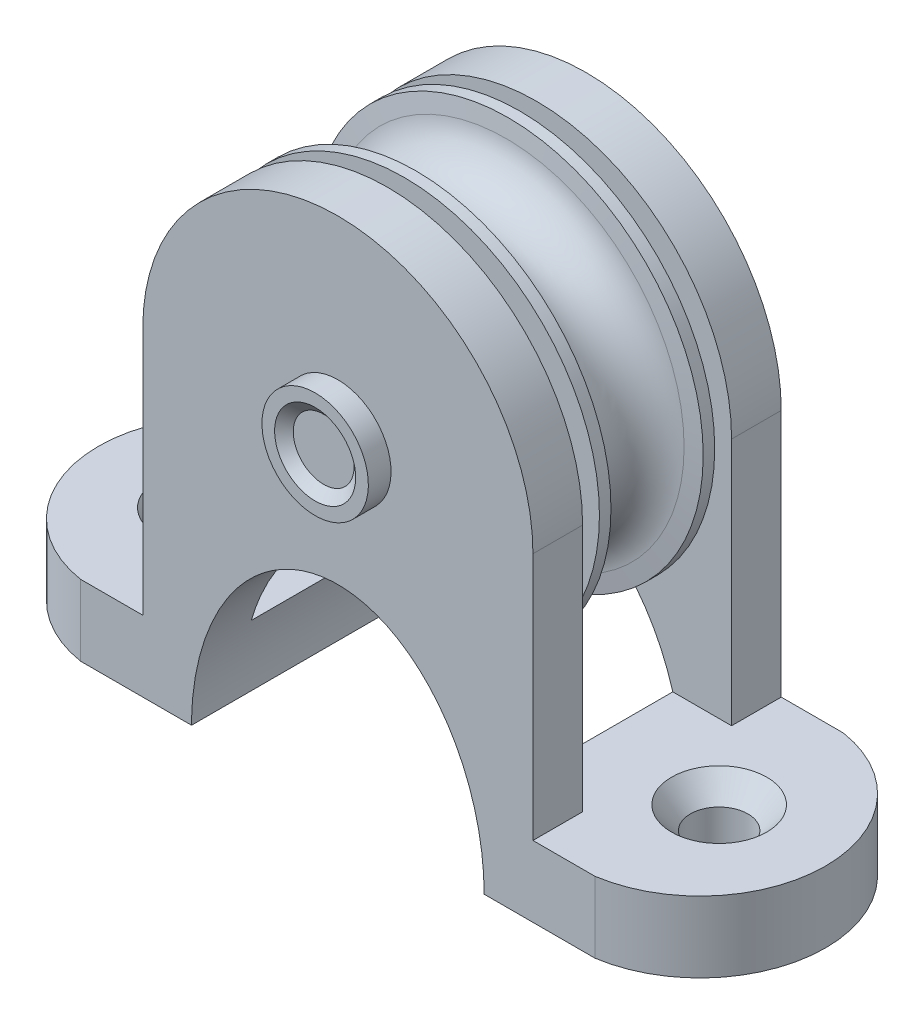
ISO-10303-21;
HEADER;
FILE_DESCRIPTION(('STEP AP214'),'2;1');
FILE_NAME('part.step','',(''),(''),'','','');
FILE_SCHEMA(('AUTOMOTIVE_DESIGN { 1 0 10303 214 1 1 1 1 }'));
ENDSEC;
DATA;
#1=APPLICATION_CONTEXT('core data for automotive mechanical design processes');
#2=APPLICATION_PROTOCOL_DEFINITION('international standard','automotive_design',2000,#1);
#3=PRODUCT_CONTEXT('',#1,'mechanical');
#4=PRODUCT('Part','Part','',(#3));
#5=PRODUCT_RELATED_PRODUCT_CATEGORY('part','',(#4));
#6=PRODUCT_DEFINITION_FORMATION('','',#4);
#7=PRODUCT_DEFINITION_CONTEXT('part definition',#1,'design');
#8=PRODUCT_DEFINITION('design','',#6,#7);
#9=PRODUCT_DEFINITION_SHAPE('','',#8);
#10=(LENGTH_UNIT() NAMED_UNIT(*) SI_UNIT(.MILLI.,.METRE.));
#11=(NAMED_UNIT(*) PLANE_ANGLE_UNIT() SI_UNIT($,.RADIAN.));
#12=(NAMED_UNIT(*) SI_UNIT($,.STERADIAN.) SOLID_ANGLE_UNIT());
#13=UNCERTAINTY_MEASURE_WITH_UNIT(LENGTH_MEASURE(1.E-05),#10,'distance_accuracy_value','');
#14=(GEOMETRIC_REPRESENTATION_CONTEXT(3) GLOBAL_UNCERTAINTY_ASSIGNED_CONTEXT((#13)) GLOBAL_UNIT_ASSIGNED_CONTEXT((#10,
#11,#12)) REPRESENTATION_CONTEXT('',''));
#15=CARTESIAN_POINT('',(0.,0.,0.));
#16=DIRECTION('',(0.,0.,1.));
#17=DIRECTION('',(1.,0.,0.));
#18=AXIS2_PLACEMENT_3D('',#15,#16,#17);
#19=CARTESIAN_POINT('',(32.54375,-22.225,-11.1125));
#20=DIRECTION('',(0.,1.,0.));
#21=DIRECTION('',(0.,0.,1.));
#22=AXIS2_PLACEMENT_3D('',#19,#20,#21);
#23=PLANE('',#22);
#24=DIRECTION('',(0.,0.,1.));
#25=VECTOR('',#24,1.);
#26=CARTESIAN_POINT('',(-12.2002757557206,-22.225,-14.1605));
#27=LINE('',#26,#25);
#28=CARTESIAN_POINT('',(-12.2002757557206,-22.225,-6.6675));
#29=VERTEX_POINT('',#28);
#30=CARTESIAN_POINT('',(-12.2002757557206,-22.225,6.6675));
#31=VERTEX_POINT('',#30);
#32=EDGE_CURVE('E153',#29,#31,#27,.T.);
#33=ORIENTED_EDGE('',*,*,#32,.F.);
#34=DIRECTION('',(1.,0.,0.));
#35=VECTOR('',#34,1.);
#36=CARTESIAN_POINT('',(-17.4625,-22.225,-6.6675));
#37=LINE('',#36,#35);
#38=CARTESIAN_POINT('',(-17.4625,-22.225,-6.6675));
#39=VERTEX_POINT('',#38);
#40=EDGE_CURVE('E162',#39,#29,#37,.T.);
#41=ORIENTED_EDGE('',*,*,#40,.F.);
#42=DIRECTION('',(0.,0.,-1.));
#43=VECTOR('',#42,1.);
#44=CARTESIAN_POINT('',(-17.4625,-22.225,-6.6675));
#45=LINE('',#44,#43);
#46=CARTESIAN_POINT('',(-17.4625,-22.225,-11.1125));
#47=VERTEX_POINT('',#46);
#48=EDGE_CURVE('E194',#39,#47,#45,.T.);
#49=ORIENTED_EDGE('',*,*,#48,.T.);
#50=DIRECTION('',(-1.,0.,0.));
#51=VECTOR('',#50,1.);
#52=CARTESIAN_POINT('',(32.54375,-22.225,-11.1125));
#53=LINE('',#52,#51);
#54=CARTESIAN_POINT('',(-23.01875,-22.225,-11.1125));
#55=VERTEX_POINT('',#54);
#56=EDGE_CURVE('E282',#47,#55,#53,.T.);
#57=ORIENTED_EDGE('',*,*,#56,.T.);
#58=CARTESIAN_POINT('',(-21.2989583333333,-22.225,0.));
#59=DIRECTION('',(0.,1.,0.));
#60=DIRECTION('',(0.,0.,1.));
#61=AXIS2_PLACEMENT_3D('',#58,#59,#60);
#62=CIRCLE('',#61,11.2447916666667);
#63=CARTESIAN_POINT('',(-23.01875,-22.225,11.1125));
#64=VERTEX_POINT('',#63);
#65=EDGE_CURVE('E184',#64,#55,#62,.F.);
#66=ORIENTED_EDGE('',*,*,#65,.F.);
#67=DIRECTION('',(1.,0.,0.));
#68=VECTOR('',#67,1.);
#69=CARTESIAN_POINT('',(-32.54375,-22.225,11.1125));
#70=LINE('',#69,#68);
#71=CARTESIAN_POINT('',(-17.4625,-22.225,11.1125));
#72=VERTEX_POINT('',#71);
#73=EDGE_CURVE('E50',#64,#72,#70,.T.);
#74=ORIENTED_EDGE('',*,*,#73,.T.);
#75=DIRECTION('',(0.,0.,1.));
#76=VECTOR('',#75,1.);
#77=CARTESIAN_POINT('',(-17.4625,-22.225,6.6675));
#78=LINE('',#77,#76);
#79=CARTESIAN_POINT('',(-17.4625,-22.225,6.6675));
#80=VERTEX_POINT('',#79);
#81=EDGE_CURVE('E228',#80,#72,#78,.T.);
#82=ORIENTED_EDGE('',*,*,#81,.F.);
#83=DIRECTION('',(1.,0.,0.));
#84=VECTOR('',#83,1.);
#85=CARTESIAN_POINT('',(-17.4625,-22.225,6.6675));
#86=LINE('',#85,#84);
#87=EDGE_CURVE('E165',#80,#31,#86,.T.);
#88=ORIENTED_EDGE('',*,*,#87,.T.);
#89=EDGE_LOOP('',(#33,#41,#49,#57,#66,#74,#82,#88));
#90=FACE_BOUND('',#89,.T.);
#91=CARTESIAN_POINT('',(-23.01875,-22.225,0.));
#92=DIRECTION('',(0.,1.,0.));
#93=DIRECTION('',(0.,0.,1.));
#94=AXIS2_PLACEMENT_3D('',#91,#92,#93);
#95=CIRCLE('',#94,4.26183731992034);
#96=CARTESIAN_POINT('',(-23.01875,-22.225,4.26183731992034));
#97=VERTEX_POINT('',#96);
#98=EDGE_CURVE('E328',#97,#97,#95,.F.);
#99=ORIENTED_EDGE('',*,*,#98,.T.);
#100=EDGE_LOOP('',(#99));
#101=FACE_BOUND('',#100,.T.);
#102=ADVANCED_FACE('F42',(#90,#101),#23,.T.);
#103=CARTESIAN_POINT('',(32.54375,-28.575,-11.1125));
#104=DIRECTION('',(0.,1.,0.));
#105=DIRECTION('',(0.,0.,1.));
#106=AXIS2_PLACEMENT_3D('',#103,#104,#105);
#107=PLANE('',#106);
#108=CARTESIAN_POINT('',(-23.01875,-28.575,0.));
#109=DIRECTION('',(0.,1.,0.));
#110=DIRECTION('',(0.,0.,1.));
#111=AXIS2_PLACEMENT_3D('',#108,#109,#110);
#112=CIRCLE('',#111,2.5781);
#113=CARTESIAN_POINT('',(-23.01875,-28.575,2.5781));
#114=VERTEX_POINT('',#113);
#115=EDGE_CURVE('E312',#114,#114,#112,.T.);
#116=ORIENTED_EDGE('',*,*,#115,.T.);
#117=EDGE_LOOP('',(#116));
#118=FACE_BOUND('',#117,.T.);
#119=DIRECTION('',(-1.,0.,0.));
#120=VECTOR('',#119,1.);
#121=CARTESIAN_POINT('',(32.54375,-28.575,-11.1125));
#122=LINE('',#121,#120);
#123=CARTESIAN_POINT('',(-13.096875,-28.575,-11.1125));
#124=VERTEX_POINT('',#123);
#125=CARTESIAN_POINT('',(-23.01875,-28.575,-11.1125));
#126=VERTEX_POINT('',#125);
#127=EDGE_CURVE('E308',#124,#126,#122,.T.);
#128=ORIENTED_EDGE('',*,*,#127,.F.);
#129=DIRECTION('',(0.,0.,1.));
#130=VECTOR('',#129,1.);
#131=CARTESIAN_POINT('',(-13.096875,-28.575,-14.1605));
#132=LINE('',#131,#130);
#133=CARTESIAN_POINT('',(-13.096875,-28.575,11.1125));
#134=VERTEX_POINT('',#133);
#135=EDGE_CURVE('E546',#124,#134,#132,.T.);
#136=ORIENTED_EDGE('',*,*,#135,.T.);
#137=DIRECTION('',(1.,0.,0.));
#138=VECTOR('',#137,1.);
#139=CARTESIAN_POINT('',(-32.54375,-28.575,11.1125));
#140=LINE('',#139,#138);
#141=CARTESIAN_POINT('',(-23.01875,-28.575,11.1125));
#142=VERTEX_POINT('',#141);
#143=EDGE_CURVE('E250',#142,#134,#140,.T.);
#144=ORIENTED_EDGE('',*,*,#143,.F.);
#145=CARTESIAN_POINT('',(-21.2989583333333,-28.575,0.));
#146=DIRECTION('',(0.,-1.,0.));
#147=DIRECTION('',(0.,0.,1.));
#148=AXIS2_PLACEMENT_3D('',#145,#146,#147);
#149=CIRCLE('',#148,11.2447916666667);
#150=EDGE_CURVE('E380',#142,#126,#149,.T.);
#151=ORIENTED_EDGE('',*,*,#150,.T.);
#152=EDGE_LOOP('',(#128,#136,#144,#151));
#153=FACE_BOUND('',#152,.T.);
#154=ADVANCED_FACE('F350',(#118,#153),#107,.F.);
#155=DIRECTION('',(0.,0.,1.));
#156=VECTOR('',#155,1.);
#157=CARTESIAN_POINT('',(12.2002757557207,-22.225,-14.1605));
#158=LINE('',#157,#156);
#159=CARTESIAN_POINT('',(12.2002757557207,-22.225,6.6675));
#160=VERTEX_POINT('',#159);
#161=CARTESIAN_POINT('',(12.2002757557207,-22.225,-6.6675));
#162=VERTEX_POINT('',#161);
#163=EDGE_CURVE('E65',#160,#162,#158,.F.);
#164=ORIENTED_EDGE('',*,*,#163,.F.);
#165=CARTESIAN_POINT('',(17.4625,-22.225,6.6675));
#166=VERTEX_POINT('',#165);
#167=EDGE_CURVE('E208',#160,#166,#86,.T.);
#168=ORIENTED_EDGE('',*,*,#167,.T.);
#169=DIRECTION('',(0.,0.,1.));
#170=VECTOR('',#169,1.);
#171=CARTESIAN_POINT('',(17.4625,-22.225,6.6675));
#172=LINE('',#171,#170);
#173=CARTESIAN_POINT('',(17.4625,-22.225,11.1125));
#174=VERTEX_POINT('',#173);
#175=EDGE_CURVE('E220',#166,#174,#172,.T.);
#176=ORIENTED_EDGE('',*,*,#175,.T.);
#177=CARTESIAN_POINT('',(23.01875,-22.225,11.1125));
#178=VERTEX_POINT('',#177);
#179=EDGE_CURVE('E239',#174,#178,#70,.T.);
#180=ORIENTED_EDGE('',*,*,#179,.T.);
#181=CARTESIAN_POINT('',(21.2989583333333,-22.225,0.));
#182=DIRECTION('',(0.,1.,0.));
#183=DIRECTION('',(0.,0.,1.));
#184=AXIS2_PLACEMENT_3D('',#181,#182,#183);
#185=CIRCLE('',#184,11.2447916666667);
#186=CARTESIAN_POINT('',(23.01875,-22.225,-11.1125));
#187=VERTEX_POINT('',#186);
#188=EDGE_CURVE('E374',#187,#178,#185,.F.);
#189=ORIENTED_EDGE('',*,*,#188,.F.);
#190=CARTESIAN_POINT('',(17.4625,-22.225,-11.1125));
#191=VERTEX_POINT('',#190);
#192=EDGE_CURVE('E243',#187,#191,#53,.T.);
#193=ORIENTED_EDGE('',*,*,#192,.T.);
#194=DIRECTION('',(0.,0.,-1.));
#195=VECTOR('',#194,1.);
#196=CARTESIAN_POINT('',(17.4625,-22.225,-6.6675));
#197=LINE('',#196,#195);
#198=CARTESIAN_POINT('',(17.4625,-22.225,-6.6675));
#199=VERTEX_POINT('',#198);
#200=EDGE_CURVE('E196',#199,#191,#197,.T.);
#201=ORIENTED_EDGE('',*,*,#200,.F.);
#202=EDGE_CURVE('E172',#162,#199,#37,.T.);
#203=ORIENTED_EDGE('',*,*,#202,.F.);
#204=EDGE_LOOP('',(#164,#168,#176,#180,#189,#193,#201,#203));
#205=FACE_BOUND('',#204,.T.);
#206=CARTESIAN_POINT('',(23.01875,-22.225,0.));
#207=DIRECTION('',(0.,1.,0.));
#208=DIRECTION('',(0.,0.,1.));
#209=AXIS2_PLACEMENT_3D('',#206,#207,#208);
#210=CIRCLE('',#209,4.26183731992034);
#211=CARTESIAN_POINT('',(23.01875,-22.225,4.26183731992034));
#212=VERTEX_POINT('',#211);
#213=EDGE_CURVE('E320',#212,#212,#210,.F.);
#214=ORIENTED_EDGE('',*,*,#213,.T.);
#215=EDGE_LOOP('',(#214));
#216=FACE_BOUND('',#215,.T.);
#217=ADVANCED_FACE('F263',(#205,#216),#23,.T.);
#218=CARTESIAN_POINT('',(13.096875,-28.575,11.1125));
#219=VERTEX_POINT('',#218);
#220=CARTESIAN_POINT('',(23.01875,-28.575,11.1125));
#221=VERTEX_POINT('',#220);
#222=EDGE_CURVE('E305',#219,#221,#140,.T.);
#223=ORIENTED_EDGE('',*,*,#222,.F.);
#224=DIRECTION('',(0.,0.,1.));
#225=VECTOR('',#224,1.);
#226=CARTESIAN_POINT('',(13.096875,-28.575,-14.1605));
#227=LINE('',#226,#225);
#228=CARTESIAN_POINT('',(13.096875,-28.575,-11.1125));
#229=VERTEX_POINT('',#228);
#230=EDGE_CURVE('E57',#219,#229,#227,.F.);
#231=ORIENTED_EDGE('',*,*,#230,.T.);
#232=CARTESIAN_POINT('',(23.01875,-28.575,-11.1125));
#233=VERTEX_POINT('',#232);
#234=EDGE_CURVE('E245',#233,#229,#122,.T.);
#235=ORIENTED_EDGE('',*,*,#234,.F.);
#236=CARTESIAN_POINT('',(21.2989583333333,-28.575,0.));
#237=DIRECTION('',(0.,-1.,0.));
#238=DIRECTION('',(0.,0.,-1.));
#239=AXIS2_PLACEMENT_3D('',#236,#237,#238);
#240=CIRCLE('',#239,11.2447916666667);
#241=EDGE_CURVE('E367',#233,#221,#240,.T.);
#242=ORIENTED_EDGE('',*,*,#241,.T.);
#243=EDGE_LOOP('',(#223,#231,#235,#242));
#244=FACE_BOUND('',#243,.T.);
#245=CARTESIAN_POINT('',(23.01875,-28.575,0.));
#246=DIRECTION('',(0.,1.,0.));
#247=DIRECTION('',(0.,0.,1.));
#248=AXIS2_PLACEMENT_3D('',#245,#246,#247);
#249=CIRCLE('',#248,2.5781);
#250=CARTESIAN_POINT('',(23.01875,-28.575,2.5781));
#251=VERTEX_POINT('',#250);
#252=EDGE_CURVE('E316',#251,#251,#249,.T.);
#253=ORIENTED_EDGE('',*,*,#252,.T.);
#254=EDGE_LOOP('',(#253));
#255=FACE_BOUND('',#254,.T.);
#256=ADVANCED_FACE('F355',(#244,#255),#107,.F.);
#257=CARTESIAN_POINT('',(32.54375,-22.225,-11.1125));
#258=DIRECTION('',(0.,0.,1.));
#259=DIRECTION('',(1.,0.,0.));
#260=AXIS2_PLACEMENT_3D('',#257,#258,#259);
#261=PLANE('',#260);
#262=ORIENTED_EDGE('',*,*,#234,.T.);
#263=CARTESIAN_POINT('',(0.,-28.575,-11.1125));
#264=DIRECTION('',(0.,0.,1.));
#265=DIRECTION('',(0.,-1.,0.));
#266=AXIS2_PLACEMENT_3D('',#263,#264,#265);
#267=ELLIPSE('',#266,17.4625,13.096875);
#268=EDGE_CURVE('E371',#229,#124,#267,.T.);
#269=ORIENTED_EDGE('',*,*,#268,.T.);
#270=ORIENTED_EDGE('',*,*,#127,.T.);
#271=DIRECTION('',(0.,1.,0.));
#272=VECTOR('',#271,1.);
#273=CARTESIAN_POINT('',(-23.01875,-28.575,-11.1125));
#274=LINE('',#273,#272);
#275=EDGE_CURVE('E287',#126,#55,#274,.T.);
#276=ORIENTED_EDGE('',*,*,#275,.T.);
#277=ORIENTED_EDGE('',*,*,#56,.F.);
#278=DIRECTION('',(0.,-1.,0.));
#279=VECTOR('',#278,1.);
#280=CARTESIAN_POINT('',(-17.4625,0.,-11.1125));
#281=LINE('',#280,#279);
#282=CARTESIAN_POINT('',(-17.4625,0.,-11.1125));
#283=VERTEX_POINT('',#282);
#284=EDGE_CURVE('E186',#283,#47,#281,.T.);
#285=ORIENTED_EDGE('',*,*,#284,.F.);
#286=CARTESIAN_POINT('',(0.,0.,-11.1125));
#287=DIRECTION('',(0.,0.,1.));
#288=DIRECTION('',(1.,0.,0.));
#289=AXIS2_PLACEMENT_3D('',#286,#287,#288);
#290=CIRCLE('',#289,17.4625);
#291=CARTESIAN_POINT('',(17.4625,0.,-11.1125));
#292=VERTEX_POINT('',#291);
#293=EDGE_CURVE('E180',#292,#283,#290,.T.);
#294=ORIENTED_EDGE('',*,*,#293,.F.);
#295=DIRECTION('',(0.,1.,0.));
#296=VECTOR('',#295,1.);
#297=CARTESIAN_POINT('',(17.4625,0.,-11.1125));
#298=LINE('',#297,#296);
#299=EDGE_CURVE('E183',#191,#292,#298,.T.);
#300=ORIENTED_EDGE('',*,*,#299,.F.);
#301=ORIENTED_EDGE('',*,*,#192,.F.);
#302=DIRECTION('',(0.,1.,0.));
#303=VECTOR('',#302,1.);
#304=CARTESIAN_POINT('',(23.01875,-28.575,-11.1125));
#305=LINE('',#304,#303);
#306=EDGE_CURVE('E375',#233,#187,#305,.T.);
#307=ORIENTED_EDGE('',*,*,#306,.F.);
#308=EDGE_LOOP('',(#262,#269,#270,#276,#277,#285,#294,#300,#301,#307));
#309=FACE_BOUND('',#308,.T.);
#310=ADVANCED_FACE('F44',(#309),#261,.F.);
#311=CARTESIAN_POINT('',(-32.54375,-22.225,11.1125));
#312=DIRECTION('',(0.,0.,-1.));
#313=DIRECTION('',(-1.,0.,0.));
#314=AXIS2_PLACEMENT_3D('',#311,#312,#313);
#315=PLANE('',#314);
#316=ORIENTED_EDGE('',*,*,#143,.T.);
#317=CARTESIAN_POINT('',(0.,-28.575,11.1125));
#318=DIRECTION('',(0.,0.,1.));
#319=DIRECTION('',(0.,-1.,0.));
#320=AXIS2_PLACEMENT_3D('',#317,#318,#319);
#321=ELLIPSE('',#320,17.4625,13.096875);
#322=EDGE_CURVE('E543',#134,#219,#321,.F.);
#323=ORIENTED_EDGE('',*,*,#322,.T.);
#324=ORIENTED_EDGE('',*,*,#222,.T.);
#325=DIRECTION('',(0.,1.,0.));
#326=VECTOR('',#325,1.);
#327=CARTESIAN_POINT('',(23.01875,-28.575,11.1125));
#328=LINE('',#327,#326);
#329=EDGE_CURVE('E370',#221,#178,#328,.T.);
#330=ORIENTED_EDGE('',*,*,#329,.T.);
#331=ORIENTED_EDGE('',*,*,#179,.F.);
#332=DIRECTION('',(0.,1.,0.));
#333=VECTOR('',#332,1.);
#334=CARTESIAN_POINT('',(17.4625,0.,11.1125));
#335=LINE('',#334,#333);
#336=CARTESIAN_POINT('',(17.4625,0.,11.1125));
#337=VERTEX_POINT('',#336);
#338=EDGE_CURVE('E205',#174,#337,#335,.T.);
#339=ORIENTED_EDGE('',*,*,#338,.T.);
#340=CARTESIAN_POINT('',(0.,0.,11.1125));
#341=DIRECTION('',(0.,0.,1.));
#342=DIRECTION('',(1.,0.,0.));
#343=AXIS2_PLACEMENT_3D('',#340,#341,#342);
#344=CIRCLE('',#343,17.4625);
#345=CARTESIAN_POINT('',(-17.4625,0.,11.1125));
#346=VERTEX_POINT('',#345);
#347=EDGE_CURVE('E193',#337,#346,#344,.T.);
#348=ORIENTED_EDGE('',*,*,#347,.T.);
#349=DIRECTION('',(0.,-1.,0.));
#350=VECTOR('',#349,1.);
#351=CARTESIAN_POINT('',(-17.4625,0.,11.1125));
#352=LINE('',#351,#350);
#353=EDGE_CURVE('E216',#346,#72,#352,.T.);
#354=ORIENTED_EDGE('',*,*,#353,.T.);
#355=ORIENTED_EDGE('',*,*,#73,.F.);
#356=DIRECTION('',(0.,1.,0.));
#357=VECTOR('',#356,1.);
#358=CARTESIAN_POINT('',(-23.01875,-28.575,11.1125));
#359=LINE('',#358,#357);
#360=EDGE_CURVE('E278',#142,#64,#359,.T.);
#361=ORIENTED_EDGE('',*,*,#360,.F.);
#362=EDGE_LOOP('',(#316,#323,#324,#330,#331,#339,#348,#354,#355,#361));
#363=FACE_BOUND('',#362,.T.);
#364=ADVANCED_FACE('F255',(#363),#315,.F.);
#365=CARTESIAN_POINT('',(-23.01875,-22.225,0.));
#366=DIRECTION('',(0.,-1.,0.));
#367=DIRECTION('',(0.,0.,-1.));
#368=AXIS2_PLACEMENT_3D('',#365,#366,#367);
#369=CYLINDRICAL_SURFACE('',#368,2.5781);
#370=CARTESIAN_POINT('',(-23.01875,-24.2316,0.));
#371=DIRECTION('',(0.,-1.,0.));
#372=DIRECTION('',(0.,0.,-1.));
#373=AXIS2_PLACEMENT_3D('',#370,#371,#372);
#374=CIRCLE('',#373,2.5781);
#375=CARTESIAN_POINT('',(-23.01875,-24.2316,-2.5781));
#376=VERTEX_POINT('',#375);
#377=EDGE_CURVE('E219',#376,#376,#374,.T.);
#378=ORIENTED_EDGE('',*,*,#377,.F.);
#379=EDGE_LOOP('',(#378));
#380=FACE_BOUND('',#379,.T.);
#381=ORIENTED_EDGE('',*,*,#115,.F.);
#382=EDGE_LOOP('',(#381));
#383=FACE_BOUND('',#382,.T.);
#384=ADVANCED_FACE('F336',(#380,#383),#369,.F.);
#385=CARTESIAN_POINT('',(23.01875,-22.225,0.));
#386=DIRECTION('',(0.,-1.,0.));
#387=DIRECTION('',(0.,0.,-1.));
#388=AXIS2_PLACEMENT_3D('',#385,#386,#387);
#389=CYLINDRICAL_SURFACE('',#388,2.5781);
#390=CARTESIAN_POINT('',(23.01875,-24.2316,0.));
#391=DIRECTION('',(0.,-1.,0.));
#392=DIRECTION('',(0.,0.,-1.));
#393=AXIS2_PLACEMENT_3D('',#390,#391,#392);
#394=CIRCLE('',#393,2.5781);
#395=CARTESIAN_POINT('',(23.01875,-24.2316,-2.5781));
#396=VERTEX_POINT('',#395);
#397=EDGE_CURVE('E325',#396,#396,#394,.T.);
#398=ORIENTED_EDGE('',*,*,#397,.F.);
#399=EDGE_LOOP('',(#398));
#400=FACE_BOUND('',#399,.T.);
#401=ORIENTED_EDGE('',*,*,#252,.F.);
#402=EDGE_LOOP('',(#401));
#403=FACE_BOUND('',#402,.T.);
#404=ADVANCED_FACE('F339',(#400,#403),#389,.F.);
#405=CARTESIAN_POINT('',(23.01875,-24.2316,0.));
#406=DIRECTION('',(0.,1.,0.));
#407=DIRECTION('',(0.,0.,-1.));
#408=AXIS2_PLACEMENT_3D('',#405,#406,#407);
#409=CONICAL_SURFACE('',#408,2.5781,0.698131700797733);
#410=ORIENTED_EDGE('',*,*,#397,.T.);
#411=EDGE_LOOP('',(#410));
#412=FACE_BOUND('',#411,.T.);
#413=ORIENTED_EDGE('',*,*,#213,.F.);
#414=EDGE_LOOP('',(#413));
#415=FACE_BOUND('',#414,.T.);
#416=ADVANCED_FACE('F345',(#412,#415),#409,.F.);
#417=CARTESIAN_POINT('',(-23.01875,-24.2316,0.));
#418=DIRECTION('',(0.,1.,0.));
#419=DIRECTION('',(0.,0.,-1.));
#420=AXIS2_PLACEMENT_3D('',#417,#418,#419);
#421=CONICAL_SURFACE('',#420,2.5781,0.698131700797733);
#422=ORIENTED_EDGE('',*,*,#377,.T.);
#423=EDGE_LOOP('',(#422));
#424=FACE_BOUND('',#423,.T.);
#425=ORIENTED_EDGE('',*,*,#98,.F.);
#426=EDGE_LOOP('',(#425));
#427=FACE_BOUND('',#426,.T.);
#428=ADVANCED_FACE('F333',(#424,#427),#421,.F.);
#429=CARTESIAN_POINT('',(0.,0.,6.6675));
#430=DIRECTION('',(0.,0.,1.));
#431=DIRECTION('',(1.,0.,0.));
#432=AXIS2_PLACEMENT_3D('',#429,#430,#431);
#433=CYLINDRICAL_SURFACE('',#432,17.4625);
#434=ORIENTED_EDGE('',*,*,#347,.F.);
#435=DIRECTION('',(0.,0.,1.));
#436=VECTOR('',#435,1.);
#437=CARTESIAN_POINT('',(17.4625,0.,6.6675));
#438=LINE('',#437,#436);
#439=CARTESIAN_POINT('',(17.4625,0.,6.6675));
#440=VERTEX_POINT('',#439);
#441=EDGE_CURVE('E217',#440,#337,#438,.T.);
#442=ORIENTED_EDGE('',*,*,#441,.F.);
#443=CARTESIAN_POINT('',(0.,0.,6.6675));
#444=DIRECTION('',(0.,0.,1.));
#445=DIRECTION('',(1.,0.,0.));
#446=AXIS2_PLACEMENT_3D('',#443,#444,#445);
#447=CIRCLE('',#446,17.4625);
#448=CARTESIAN_POINT('',(-17.4625,0.,6.6675));
#449=VERTEX_POINT('',#448);
#450=EDGE_CURVE('E201',#440,#449,#447,.T.);
#451=ORIENTED_EDGE('',*,*,#450,.T.);
#452=DIRECTION('',(0.,0.,1.));
#453=VECTOR('',#452,1.);
#454=CARTESIAN_POINT('',(-17.4625,0.,6.6675));
#455=LINE('',#454,#453);
#456=EDGE_CURVE('E213',#449,#346,#455,.T.);
#457=ORIENTED_EDGE('',*,*,#456,.T.);
#458=EDGE_LOOP('',(#434,#442,#451,#457));
#459=FACE_BOUND('',#458,.T.);
#460=ADVANCED_FACE('F272',(#459),#433,.T.);
#461=CARTESIAN_POINT('',(17.4625,0.,6.6675));
#462=DIRECTION('',(1.,0.,0.));
#463=DIRECTION('',(0.,1.,0.));
#464=AXIS2_PLACEMENT_3D('',#461,#462,#463);
#465=PLANE('',#464);
#466=ORIENTED_EDGE('',*,*,#338,.F.);
#467=ORIENTED_EDGE('',*,*,#175,.F.);
#468=DIRECTION('',(0.,1.,0.));
#469=VECTOR('',#468,1.);
#470=CARTESIAN_POINT('',(17.4625,0.,6.6675));
#471=LINE('',#470,#469);
#472=EDGE_CURVE('E210',#166,#440,#471,.T.);
#473=ORIENTED_EDGE('',*,*,#472,.T.);
#474=ORIENTED_EDGE('',*,*,#441,.T.);
#475=EDGE_LOOP('',(#466,#467,#473,#474));
#476=FACE_BOUND('',#475,.T.);
#477=ADVANCED_FACE('F260',(#476),#465,.T.);
#478=CARTESIAN_POINT('',(-17.4625,0.,6.6675));
#479=DIRECTION('',(-1.,0.,0.));
#480=DIRECTION('',(0.,-1.,0.));
#481=AXIS2_PLACEMENT_3D('',#478,#479,#480);
#482=PLANE('',#481);
#483=ORIENTED_EDGE('',*,*,#353,.F.);
#484=ORIENTED_EDGE('',*,*,#456,.F.);
#485=DIRECTION('',(0.,-1.,0.));
#486=VECTOR('',#485,1.);
#487=CARTESIAN_POINT('',(-17.4625,0.,6.6675));
#488=LINE('',#487,#486);
#489=EDGE_CURVE('E204',#449,#80,#488,.T.);
#490=ORIENTED_EDGE('',*,*,#489,.T.);
#491=ORIENTED_EDGE('',*,*,#81,.T.);
#492=EDGE_LOOP('',(#483,#484,#490,#491));
#493=FACE_BOUND('',#492,.T.);
#494=ADVANCED_FACE('F275',(#493),#482,.T.);
#495=CARTESIAN_POINT('',(0.,0.,6.6675));
#496=DIRECTION('',(0.,0.,1.));
#497=DIRECTION('',(1.,0.,0.));
#498=AXIS2_PLACEMENT_3D('',#495,#496,#497);
#499=PLANE('',#498);
#500=ORIENTED_EDGE('',*,*,#167,.F.);
#501=CARTESIAN_POINT('',(0.,-28.575,6.6675));
#502=DIRECTION('',(0.,0.,1.));
#503=DIRECTION('',(0.,-1.,0.));
#504=AXIS2_PLACEMENT_3D('',#501,#502,#503);
#505=ELLIPSE('',#504,17.4625,13.096875);
#506=EDGE_CURVE('E166',#160,#31,#505,.T.);
#507=ORIENTED_EDGE('',*,*,#506,.T.);
#508=ORIENTED_EDGE('',*,*,#87,.F.);
#509=ORIENTED_EDGE('',*,*,#489,.F.);
#510=ORIENTED_EDGE('',*,*,#450,.F.);
#511=ORIENTED_EDGE('',*,*,#472,.F.);
#512=EDGE_LOOP('',(#500,#507,#508,#509,#510,#511));
#513=FACE_BOUND('',#512,.T.);
#514=ADVANCED_FACE('F268',(#513),#499,.F.);
#515=CARTESIAN_POINT('',(0.,0.,-6.6675));
#516=DIRECTION('',(0.,0.,-1.));
#517=DIRECTION('',(-1.,0.,0.));
#518=AXIS2_PLACEMENT_3D('',#515,#516,#517);
#519=CYLINDRICAL_SURFACE('',#518,17.4625);
#520=ORIENTED_EDGE('',*,*,#293,.T.);
#521=DIRECTION('',(0.,0.,-1.));
#522=VECTOR('',#521,1.);
#523=CARTESIAN_POINT('',(-17.4625,0.,-6.6675));
#524=LINE('',#523,#522);
#525=CARTESIAN_POINT('',(-17.4625,0.,-6.6675));
#526=VERTEX_POINT('',#525);
#527=EDGE_CURVE('E190',#526,#283,#524,.T.);
#528=ORIENTED_EDGE('',*,*,#527,.F.);
#529=CARTESIAN_POINT('',(0.,0.,-6.6675));
#530=DIRECTION('',(0.,0.,1.));
#531=DIRECTION('',(1.,0.,0.));
#532=AXIS2_PLACEMENT_3D('',#529,#530,#531);
#533=CIRCLE('',#532,17.4625);
#534=CARTESIAN_POINT('',(17.4625,0.,-6.6675));
#535=VERTEX_POINT('',#534);
#536=EDGE_CURVE('E189',#535,#526,#533,.T.);
#537=ORIENTED_EDGE('',*,*,#536,.F.);
#538=DIRECTION('',(0.,0.,-1.));
#539=VECTOR('',#538,1.);
#540=CARTESIAN_POINT('',(17.4625,0.,-6.6675));
#541=LINE('',#540,#539);
#542=EDGE_CURVE('E174',#535,#292,#541,.T.);
#543=ORIENTED_EDGE('',*,*,#542,.T.);
#544=EDGE_LOOP('',(#520,#528,#537,#543));
#545=FACE_BOUND('',#544,.T.);
#546=ADVANCED_FACE('F300',(#545),#519,.T.);
#547=CARTESIAN_POINT('',(-17.4625,0.,-6.6675));
#548=DIRECTION('',(1.,0.,0.));
#549=DIRECTION('',(0.,1.,0.));
#550=AXIS2_PLACEMENT_3D('',#547,#548,#549);
#551=PLANE('',#550);
#552=ORIENTED_EDGE('',*,*,#284,.T.);
#553=ORIENTED_EDGE('',*,*,#48,.F.);
#554=DIRECTION('',(0.,-1.,0.));
#555=VECTOR('',#554,1.);
#556=CARTESIAN_POINT('',(-17.4625,0.,-6.6675));
#557=LINE('',#556,#555);
#558=EDGE_CURVE('E170',#526,#39,#557,.T.);
#559=ORIENTED_EDGE('',*,*,#558,.F.);
#560=ORIENTED_EDGE('',*,*,#527,.T.);
#561=EDGE_LOOP('',(#552,#553,#559,#560));
#562=FACE_BOUND('',#561,.T.);
#563=ADVANCED_FACE('F302',(#562),#551,.F.);
#564=CARTESIAN_POINT('',(17.4625,0.,-6.6675));
#565=DIRECTION('',(-1.,0.,0.));
#566=DIRECTION('',(0.,-1.,0.));
#567=AXIS2_PLACEMENT_3D('',#564,#565,#566);
#568=PLANE('',#567);
#569=ORIENTED_EDGE('',*,*,#299,.T.);
#570=ORIENTED_EDGE('',*,*,#542,.F.);
#571=DIRECTION('',(0.,1.,0.));
#572=VECTOR('',#571,1.);
#573=CARTESIAN_POINT('',(17.4625,0.,-6.6675));
#574=LINE('',#573,#572);
#575=EDGE_CURVE('E176',#199,#535,#574,.T.);
#576=ORIENTED_EDGE('',*,*,#575,.F.);
#577=ORIENTED_EDGE('',*,*,#200,.T.);
#578=EDGE_LOOP('',(#569,#570,#576,#577));
#579=FACE_BOUND('',#578,.T.);
#580=ADVANCED_FACE('F296',(#579),#568,.F.);
#581=CARTESIAN_POINT('',(0.,0.,-6.6675));
#582=DIRECTION('',(0.,0.,-1.));
#583=DIRECTION('',(1.,0.,0.));
#584=AXIS2_PLACEMENT_3D('',#581,#582,#583);
#585=PLANE('',#584);
#586=ORIENTED_EDGE('',*,*,#40,.T.);
#587=CARTESIAN_POINT('',(0.,-28.575,-6.6675));
#588=DIRECTION('',(0.,0.,1.));
#589=DIRECTION('',(0.,-1.,0.));
#590=AXIS2_PLACEMENT_3D('',#587,#588,#589);
#591=ELLIPSE('',#590,17.4625,13.096875);
#592=EDGE_CURVE('E12',#29,#162,#591,.F.);
#593=ORIENTED_EDGE('',*,*,#592,.T.);
#594=ORIENTED_EDGE('',*,*,#202,.T.);
#595=ORIENTED_EDGE('',*,*,#575,.T.);
#596=ORIENTED_EDGE('',*,*,#536,.T.);
#597=ORIENTED_EDGE('',*,*,#558,.T.);
#598=EDGE_LOOP('',(#586,#593,#594,#595,#596,#597));
#599=FACE_BOUND('',#598,.T.);
#600=ADVANCED_FACE('F168',(#599),#585,.F.);
#601=CARTESIAN_POINT('',(-21.2989583333333,-28.575,0.));
#602=DIRECTION('',(0.,1.,0.));
#603=DIRECTION('',(0.,0.,1.));
#604=AXIS2_PLACEMENT_3D('',#601,#602,#603);
#605=CYLINDRICAL_SURFACE('',#604,11.2447916666667);
#606=ORIENTED_EDGE('',*,*,#65,.T.);
#607=ORIENTED_EDGE('',*,*,#275,.F.);
#608=ORIENTED_EDGE('',*,*,#150,.F.);
#609=ORIENTED_EDGE('',*,*,#360,.T.);
#610=EDGE_LOOP('',(#606,#607,#608,#609));
#611=FACE_BOUND('',#610,.T.);
#612=ADVANCED_FACE('F383',(#611),#605,.T.);
#613=CARTESIAN_POINT('',(21.2989583333333,-28.575,0.));
#614=DIRECTION('',(0.,1.,0.));
#615=DIRECTION('',(0.,0.,1.));
#616=AXIS2_PLACEMENT_3D('',#613,#614,#615);
#617=CYLINDRICAL_SURFACE('',#616,11.2447916666667);
#618=ORIENTED_EDGE('',*,*,#188,.T.);
#619=ORIENTED_EDGE('',*,*,#329,.F.);
#620=ORIENTED_EDGE('',*,*,#241,.F.);
#621=ORIENTED_EDGE('',*,*,#306,.T.);
#622=EDGE_LOOP('',(#618,#619,#620,#621));
#623=FACE_BOUND('',#622,.T.);
#624=ADVANCED_FACE('F373',(#623),#617,.T.);
#625=CARTESIAN_POINT('',(0.,-28.575,-14.1605));
#626=DIRECTION('',(0.,0.,1.));
#627=DIRECTION('',(0.,-1.,0.));
#628=AXIS2_PLACEMENT_3D('',#625,#626,#627);
#629=ELLIPSE('',#628,17.4625,13.096875);
#630=DIRECTION('',(0.,0.,1.));
#631=VECTOR('',#630,1.);
#632=SURFACE_OF_LINEAR_EXTRUSION('',#629,#631);
#633=ORIENTED_EDGE('',*,*,#163,.T.);
#634=ORIENTED_EDGE('',*,*,#592,.F.);
#635=ORIENTED_EDGE('',*,*,#32,.T.);
#636=ORIENTED_EDGE('',*,*,#506,.F.);
#637=EDGE_LOOP('',(#633,#634,#635,#636));
#638=FACE_BOUND('',#637,.T.);
#639=ORIENTED_EDGE('',*,*,#230,.F.);
#640=ORIENTED_EDGE('',*,*,#322,.F.);
#641=ORIENTED_EDGE('',*,*,#135,.F.);
#642=ORIENTED_EDGE('',*,*,#268,.F.);
#643=EDGE_LOOP('',(#639,#640,#641,#642));
#644=FACE_BOUND('',#643,.T.);
#645=ADVANCED_FACE('F152',(#638,#644),#632,.F.);
#646=CLOSED_SHELL('',(#102,#154,#217,#256,#310,#364,#384,#404,#416,#428,#460,#477,#494,#514,
#546,#563,#580,#600,#612,#624,#645));
#647=MANIFOLD_SOLID_BREP('B2',#646);
#648=CARTESIAN_POINT('',(0.,0.,5.159375));
#649=DIRECTION('',(0.,0.,1.));
#650=DIRECTION('',(1.,0.,0.));
#651=AXIS2_PLACEMENT_3D('',#648,#649,#650);
#652=CYLINDRICAL_SURFACE('',#651,17.4625);
#653=CARTESIAN_POINT('',(0.,0.,5.159375));
#654=DIRECTION('',(0.,0.,1.));
#655=DIRECTION('',(1.,0.,0.));
#656=AXIS2_PLACEMENT_3D('',#653,#654,#655);
#657=CIRCLE('',#656,17.4625);
#658=CARTESIAN_POINT('',(17.4625,0.,5.159375));
#659=VERTEX_POINT('',#658);
#660=EDGE_CURVE('E574',#659,#659,#657,.T.);
#661=ORIENTED_EDGE('',*,*,#660,.F.);
#662=EDGE_LOOP('',(#661));
#663=FACE_BOUND('',#662,.T.);
#664=CARTESIAN_POINT('',(0.,0.,4.1275));
#665=DIRECTION('',(0.,0.,1.));
#666=DIRECTION('',(1.,0.,0.));
#667=AXIS2_PLACEMENT_3D('',#664,#665,#666);
#668=CIRCLE('',#667,17.4625);
#669=CARTESIAN_POINT('',(17.4625,0.,4.1275));
#670=VERTEX_POINT('',#669);
#671=EDGE_CURVE('E41',#670,#670,#668,.T.);
#672=ORIENTED_EDGE('',*,*,#671,.T.);
#673=EDGE_LOOP('',(#672));
#674=FACE_BOUND('',#673,.T.);
#675=ADVANCED_FACE('F552',(#663,#674),#652,.T.);
#676=CARTESIAN_POINT('',(0.,0.,3.93845834351105));
#677=DIRECTION('',(0.,0.,1.));
#678=DIRECTION('',(1.,0.,0.));
#679=AXIS2_PLACEMENT_3D('',#676,#677,#678);
#680=CONICAL_SURFACE('',#679,15.9412147028789,1.44716564723654);
#681=ORIENTED_EDGE('',*,*,#671,.F.);
#682=EDGE_LOOP('',(#681));
#683=FACE_BOUND('',#682,.T.);
#684=CARTESIAN_POINT('',(0.,0.,3.93845834351105));
#685=DIRECTION('',(0.,0.,1.));
#686=DIRECTION('',(1.,0.,0.));
#687=AXIS2_PLACEMENT_3D('',#684,#685,#686);
#688=CIRCLE('',#687,15.9412147028789);
#689=CARTESIAN_POINT('',(15.9412147028789,0.,3.93845834351105));
#690=VERTEX_POINT('',#689);
#691=EDGE_CURVE('E559',#690,#690,#688,.T.);
#692=ORIENTED_EDGE('',*,*,#691,.T.);
#693=EDGE_LOOP('',(#692));
#694=FACE_BOUND('',#693,.T.);
#695=ADVANCED_FACE('F625',(#683,#694),#680,.T.);
#696=CARTESIAN_POINT('',(0.,0.,0.));
#697=DIRECTION('',(0.,0.,1.));
#698=DIRECTION('',(1.,0.,0.));
#699=AXIS2_PLACEMENT_3D('',#696,#697,#698);
#700=TOROIDAL_SURFACE('',#699,16.430625,3.96875);
#701=ORIENTED_EDGE('',*,*,#691,.F.);
#702=EDGE_LOOP('',(#701));
#703=FACE_BOUND('',#702,.T.);
#704=CARTESIAN_POINT('',(0.,0.,-3.93845834351105));
#705=DIRECTION('',(0.,0.,1.));
#706=DIRECTION('',(1.,0.,0.));
#707=AXIS2_PLACEMENT_3D('',#704,#705,#706);
#708=CIRCLE('',#707,15.9412147028789);
#709=CARTESIAN_POINT('',(15.9412147028789,0.,-3.93845834351105));
#710=VERTEX_POINT('',#709);
#711=EDGE_CURVE('E563',#710,#710,#708,.T.);
#712=ORIENTED_EDGE('',*,*,#711,.T.);
#713=EDGE_LOOP('',(#712));
#714=FACE_BOUND('',#713,.T.);
#715=ADVANCED_FACE('F630',(#703,#714),#700,.F.);
#716=CARTESIAN_POINT('',(0.,0.,-4.1275));
#717=DIRECTION('',(0.,0.,-1.));
#718=DIRECTION('',(-1.,0.,0.));
#719=AXIS2_PLACEMENT_3D('',#716,#717,#718);
#720=CONICAL_SURFACE('',#719,17.4625,1.44716564723654);
#721=ORIENTED_EDGE('',*,*,#711,.F.);
#722=EDGE_LOOP('',(#721));
#723=FACE_BOUND('',#722,.T.);
#724=CARTESIAN_POINT('',(0.,0.,-4.1275));
#725=DIRECTION('',(0.,0.,1.));
#726=DIRECTION('',(1.,0.,0.));
#727=AXIS2_PLACEMENT_3D('',#724,#725,#726);
#728=CIRCLE('',#727,17.4625);
#729=CARTESIAN_POINT('',(17.4625,0.,-4.1275));
#730=VERTEX_POINT('',#729);
#731=EDGE_CURVE('E568',#730,#730,#728,.T.);
#732=ORIENTED_EDGE('',*,*,#731,.T.);
#733=EDGE_LOOP('',(#732));
#734=FACE_BOUND('',#733,.T.);
#735=ADVANCED_FACE('F637',(#723,#734),#720,.T.);
#736=CARTESIAN_POINT('',(0.,0.,5.159375));
#737=DIRECTION('',(0.,0.,1.));
#738=DIRECTION('',(1.,0.,0.));
#739=AXIS2_PLACEMENT_3D('',#736,#737,#738);
#740=CYLINDRICAL_SURFACE('',#739,17.4625);
#741=ORIENTED_EDGE('',*,*,#731,.F.);
#742=EDGE_LOOP('',(#741));
#743=FACE_BOUND('',#742,.T.);
#744=CARTESIAN_POINT('',(0.,0.,-5.159375));
#745=DIRECTION('',(0.,0.,1.));
#746=DIRECTION('',(1.,0.,0.));
#747=AXIS2_PLACEMENT_3D('',#744,#745,#746);
#748=CIRCLE('',#747,17.4625);
#749=CARTESIAN_POINT('',(17.4625,0.,-5.159375));
#750=VERTEX_POINT('',#749);
#751=EDGE_CURVE('E571',#750,#750,#748,.T.);
#752=ORIENTED_EDGE('',*,*,#751,.T.);
#753=EDGE_LOOP('',(#752));
#754=FACE_BOUND('',#753,.T.);
#755=ADVANCED_FACE('F644',(#743,#754),#740,.T.);
#756=CARTESIAN_POINT('',(0.,0.,-5.159375));
#757=DIRECTION('',(0.,0.,1.));
#758=DIRECTION('',(1.,0.,0.));
#759=AXIS2_PLACEMENT_3D('',#756,#757,#758);
#760=PLANE('',#759);
#761=CARTESIAN_POINT('',(0.,0.,-5.159375));
#762=DIRECTION('',(0.,0.,1.));
#763=DIRECTION('',(1.,0.,0.));
#764=AXIS2_PLACEMENT_3D('',#761,#762,#763);
#765=CIRCLE('',#764,3.175);
#766=CARTESIAN_POINT('',(3.175,0.,-5.159375));
#767=VERTEX_POINT('',#766);
#768=EDGE_CURVE('E577',#767,#767,#765,.T.);
#769=ORIENTED_EDGE('',*,*,#768,.T.);
#770=EDGE_LOOP('',(#769));
#771=FACE_BOUND('',#770,.T.);
#772=ORIENTED_EDGE('',*,*,#751,.F.);
#773=EDGE_LOOP('',(#772));
#774=FACE_BOUND('',#773,.T.);
#775=ADVANCED_FACE('F621',(#771,#774),#760,.F.);
#776=CARTESIAN_POINT('',(0.,17.4625,5.159375));
#777=DIRECTION('',(0.,0.,-1.));
#778=DIRECTION('',(-1.,0.,0.));
#779=AXIS2_PLACEMENT_3D('',#776,#777,#778);
#780=PLANE('',#779);
#781=CARTESIAN_POINT('',(0.,0.,5.159375));
#782=DIRECTION('',(0.,0.,-1.));
#783=DIRECTION('',(-1.,0.,0.));
#784=AXIS2_PLACEMENT_3D('',#781,#782,#783);
#785=CIRCLE('',#784,3.175);
#786=CARTESIAN_POINT('',(-3.175,0.,5.159375));
#787=VERTEX_POINT('',#786);
#788=EDGE_CURVE('E555',#787,#787,#785,.T.);
#789=ORIENTED_EDGE('',*,*,#788,.T.);
#790=EDGE_LOOP('',(#789));
#791=FACE_BOUND('',#790,.T.);
#792=ORIENTED_EDGE('',*,*,#660,.T.);
#793=EDGE_LOOP('',(#792));
#794=FACE_BOUND('',#793,.T.);
#795=ADVANCED_FACE('F611',(#791,#794),#780,.F.);
#796=CARTESIAN_POINT('',(0.,0.,-14.1605));
#797=DIRECTION('',(0.,0.,-1.));
#798=DIRECTION('',(0.,1.,0.));
#799=AXIS2_PLACEMENT_3D('',#796,#797,#798);
#800=CYLINDRICAL_SURFACE('',#799,4.7625);
#801=CARTESIAN_POINT('',(0.,0.,13.1445));
#802=DIRECTION('',(0.,0.,-1.));
#803=DIRECTION('',(0.,1.,0.));
#804=AXIS2_PLACEMENT_3D('',#801,#802,#803);
#805=CIRCLE('',#804,4.7625);
#806=CARTESIAN_POINT('',(0.,4.7625,13.1445));
#807=VERTEX_POINT('',#806);
#808=EDGE_CURVE('E598',#807,#807,#805,.T.);
#809=ORIENTED_EDGE('',*,*,#808,.T.);
#810=EDGE_LOOP('',(#809));
#811=FACE_BOUND('',#810,.T.);
#812=CARTESIAN_POINT('',(0.,0.,11.1125));
#813=DIRECTION('',(0.,0.,-1.));
#814=DIRECTION('',(0.,1.,0.));
#815=AXIS2_PLACEMENT_3D('',#812,#813,#814);
#816=CIRCLE('',#815,4.7625);
#817=CARTESIAN_POINT('',(0.,4.7625,11.1125));
#818=VERTEX_POINT('',#817);
#819=EDGE_CURVE('E601',#818,#818,#816,.T.);
#820=ORIENTED_EDGE('',*,*,#819,.F.);
#821=EDGE_LOOP('',(#820));
#822=FACE_BOUND('',#821,.T.);
#823=ADVANCED_FACE('F608',(#811,#822),#800,.T.);
#824=CARTESIAN_POINT('',(0.,4.7625,13.1445));
#825=DIRECTION('',(0.,0.,1.));
#826=DIRECTION('',(0.,-1.,0.));
#827=AXIS2_PLACEMENT_3D('',#824,#825,#826);
#828=PLANE('',#827);
#829=CARTESIAN_POINT('',(0.,0.,13.1445));
#830=DIRECTION('',(0.,0.,-1.));
#831=DIRECTION('',(0.,1.,0.));
#832=AXIS2_PLACEMENT_3D('',#829,#830,#831);
#833=CIRCLE('',#832,3.62905811877839);
#834=CARTESIAN_POINT('',(0.,3.62905811877839,13.1445));
#835=VERTEX_POINT('',#834);
#836=EDGE_CURVE('E595',#835,#835,#833,.T.);
#837=ORIENTED_EDGE('',*,*,#836,.T.);
#838=EDGE_LOOP('',(#837));
#839=FACE_BOUND('',#838,.T.);
#840=ORIENTED_EDGE('',*,*,#808,.F.);
#841=EDGE_LOOP('',(#840));
#842=FACE_BOUND('',#841,.T.);
#843=ADVANCED_FACE('F610',(#839,#842),#828,.T.);
#844=CARTESIAN_POINT('',(0.,0.,13.1445));
#845=DIRECTION('',(0.,0.,1.));
#846=DIRECTION('',(0.,-1.,0.));
#847=AXIS2_PLACEMENT_3D('',#844,#845,#846);
#848=CONICAL_SURFACE('',#847,3.62905811877839,0.872664625997158);
#849=CARTESIAN_POINT('',(0.,0.,12.3825));
#850=DIRECTION('',(0.,0.,-1.));
#851=DIRECTION('',(0.,1.,0.));
#852=AXIS2_PLACEMENT_3D('',#849,#850,#851);
#853=CIRCLE('',#852,2.72094188122161);
#854=CARTESIAN_POINT('',(0.,2.72094188122161,12.3825));
#855=VERTEX_POINT('',#854);
#856=EDGE_CURVE('E592',#855,#855,#853,.T.);
#857=ORIENTED_EDGE('',*,*,#856,.T.);
#858=EDGE_LOOP('',(#857));
#859=FACE_BOUND('',#858,.T.);
#860=ORIENTED_EDGE('',*,*,#836,.F.);
#861=EDGE_LOOP('',(#860));
#862=FACE_BOUND('',#861,.T.);
#863=ADVANCED_FACE('F618',(#859,#862),#848,.F.);
#864=CARTESIAN_POINT('',(0.,2.72094188122161,12.3825));
#865=DIRECTION('',(0.,0.,1.));
#866=DIRECTION('',(0.,-1.,0.));
#867=AXIS2_PLACEMENT_3D('',#864,#865,#866);
#868=PLANE('',#867);
#869=ORIENTED_EDGE('',*,*,#856,.F.);
#870=EDGE_LOOP('',(#869));
#871=FACE_BOUND('',#870,.T.);
#872=ADVANCED_FACE('F655',(#871),#868,.T.);
#873=CARTESIAN_POINT('',(0.,3.175,11.1125));
#874=DIRECTION('',(0.,0.,-1.));
#875=DIRECTION('',(0.,1.,0.));
#876=AXIS2_PLACEMENT_3D('',#873,#874,#875);
#877=PLANE('',#876);
#878=ORIENTED_EDGE('',*,*,#819,.T.);
#879=EDGE_LOOP('',(#878));
#880=FACE_BOUND('',#879,.T.);
#881=CARTESIAN_POINT('',(0.,0.,11.1125));
#882=DIRECTION('',(0.,0.,-1.));
#883=DIRECTION('',(0.,1.,0.));
#884=AXIS2_PLACEMENT_3D('',#881,#882,#883);
#885=CIRCLE('',#884,3.175);
#886=CARTESIAN_POINT('',(0.,3.175,11.1125));
#887=VERTEX_POINT('',#886);
#888=EDGE_CURVE('E580',#887,#887,#885,.T.);
#889=ORIENTED_EDGE('',*,*,#888,.F.);
#890=EDGE_LOOP('',(#889));
#891=FACE_BOUND('',#890,.T.);
#892=ADVANCED_FACE('F605',(#880,#891),#877,.T.);
#893=CARTESIAN_POINT('',(0.,0.,-14.1605));
#894=DIRECTION('',(0.,0.,-1.));
#895=DIRECTION('',(0.,1.,0.));
#896=AXIS2_PLACEMENT_3D('',#893,#894,#895);
#897=CYLINDRICAL_SURFACE('',#896,3.175);
#898=ORIENTED_EDGE('',*,*,#888,.T.);
#899=EDGE_LOOP('',(#898));
#900=FACE_BOUND('',#899,.T.);
#901=ORIENTED_EDGE('',*,*,#788,.F.);
#902=EDGE_LOOP('',(#901));
#903=FACE_BOUND('',#902,.T.);
#904=ADVANCED_FACE('F654',(#900,#903),#897,.T.);
#905=CARTESIAN_POINT('',(0.,0.,-11.1125));
#906=DIRECTION('',(0.,0.,-1.));
#907=DIRECTION('',(0.,1.,0.));
#908=AXIS2_PLACEMENT_3D('',#905,#906,#907);
#909=CIRCLE('',#908,3.175);
#910=CARTESIAN_POINT('',(0.,3.175,-11.1125));
#911=VERTEX_POINT('',#910);
#912=EDGE_CURVE('E583',#911,#911,#909,.T.);
#913=ORIENTED_EDGE('',*,*,#912,.F.);
#914=EDGE_LOOP('',(#913));
#915=FACE_BOUND('',#914,.T.);
#916=ORIENTED_EDGE('',*,*,#768,.F.);
#917=EDGE_LOOP('',(#916));
#918=FACE_BOUND('',#917,.T.);
#919=ADVANCED_FACE('F656',(#915,#918),#897,.T.);
#920=CARTESIAN_POINT('',(0.,3.175,-11.1125));
#921=DIRECTION('',(0.,0.,1.));
#922=DIRECTION('',(0.,-1.,0.));
#923=AXIS2_PLACEMENT_3D('',#920,#921,#922);
#924=PLANE('',#923);
#925=ORIENTED_EDGE('',*,*,#912,.T.);
#926=EDGE_LOOP('',(#925));
#927=FACE_BOUND('',#926,.T.);
#928=CARTESIAN_POINT('',(0.,0.,-11.1125));
#929=DIRECTION('',(0.,0.,-1.));
#930=DIRECTION('',(0.,1.,0.));
#931=AXIS2_PLACEMENT_3D('',#928,#929,#930);
#932=CIRCLE('',#931,5.55625);
#933=CARTESIAN_POINT('',(0.,5.55625,-11.1125));
#934=VERTEX_POINT('',#933);
#935=EDGE_CURVE('E586',#934,#934,#932,.T.);
#936=ORIENTED_EDGE('',*,*,#935,.F.);
#937=EDGE_LOOP('',(#936));
#938=FACE_BOUND('',#937,.T.);
#939=ADVANCED_FACE('F659',(#927,#938),#924,.T.);
#940=CARTESIAN_POINT('',(0.,0.,-14.1605));
#941=DIRECTION('',(0.,0.,-1.));
#942=DIRECTION('',(0.,1.,0.));
#943=AXIS2_PLACEMENT_3D('',#940,#941,#942);
#944=CYLINDRICAL_SURFACE('',#943,5.55625);
#945=ORIENTED_EDGE('',*,*,#935,.T.);
#946=EDGE_LOOP('',(#945));
#947=FACE_BOUND('',#946,.T.);
#948=CARTESIAN_POINT('',(0.,0.,-11.8745));
#949=DIRECTION('',(0.,0.,-1.));
#950=DIRECTION('',(0.,1.,0.));
#951=AXIS2_PLACEMENT_3D('',#948,#949,#950);
#952=CIRCLE('',#951,5.55625);
#953=CARTESIAN_POINT('',(0.,5.55625,-11.8745));
#954=VERTEX_POINT('',#953);
#955=EDGE_CURVE('E589',#954,#954,#952,.T.);
#956=ORIENTED_EDGE('',*,*,#955,.F.);
#957=EDGE_LOOP('',(#956));
#958=FACE_BOUND('',#957,.T.);
#959=ADVANCED_FACE('F663',(#947,#958),#944,.T.);
#960=CARTESIAN_POINT('',(0.,0.,-6.26511284722222));
#961=DIRECTION('',(0.,0.,-1.));
#962=DIRECTION('',(0.,-1.,0.));
#963=AXIS2_PLACEMENT_3D('',#960,#961,#962);
#964=SPHERICAL_SURFACE('',#963,7.89538715277778);
#965=ORIENTED_EDGE('',*,*,#955,.T.);
#966=EDGE_LOOP('',(#965));
#967=FACE_BOUND('',#966,.T.);
#968=ADVANCED_FACE('F667',(#967),#964,.T.);
#969=CLOSED_SHELL('',(#675,#695,#715,#735,#755,#775,#795,#823,#843,#863,#872,#892,#904,#919,
#939,#959,#968));
#970=MANIFOLD_SOLID_BREP('B6',#969);
#971=ADVANCED_BREP_SHAPE_REPRESENTATION('',(#18,#647,#970),#14);
#972=SHAPE_DEFINITION_REPRESENTATION(#9,#971);
ENDSEC;
END-ISO-10303-21;
